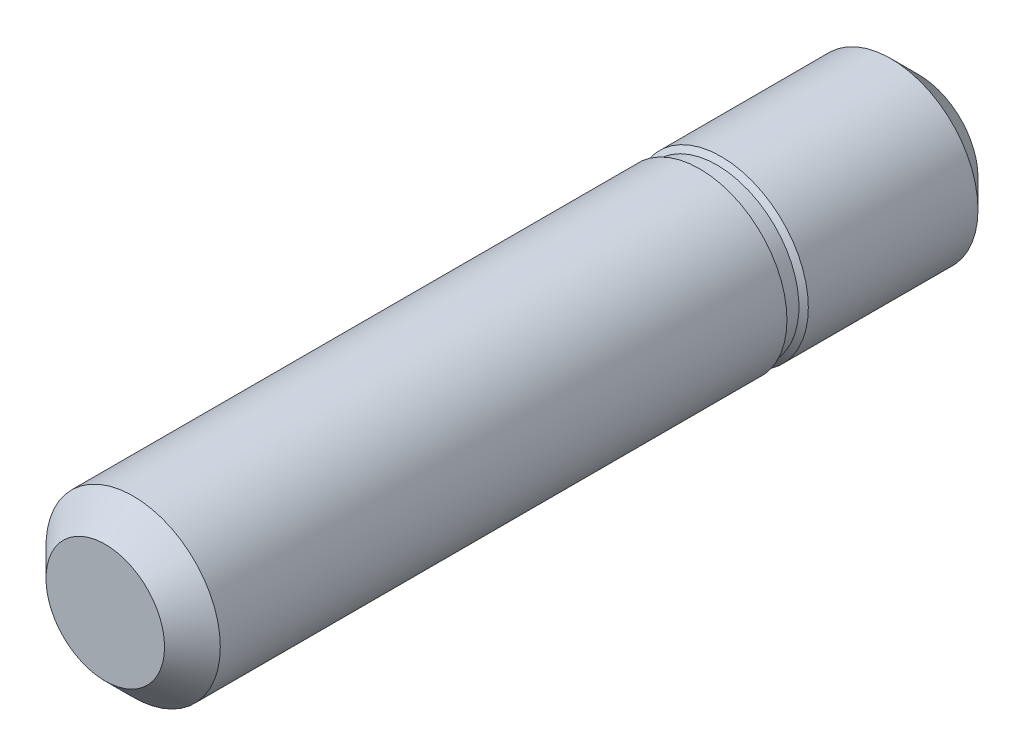
ISO-10303-21;
HEADER;
FILE_DESCRIPTION(('STEP AP214'),'2;1');
FILE_NAME('part.step','',(''),(''),'','','');
FILE_SCHEMA(('AUTOMOTIVE_DESIGN { 1 0 10303 214 1 1 1 1 }'));
ENDSEC;
DATA;
#1=APPLICATION_CONTEXT('core data for automotive mechanical design processes');
#2=APPLICATION_PROTOCOL_DEFINITION('international standard','automotive_design',2000,#1);
#3=PRODUCT_CONTEXT('',#1,'mechanical');
#4=PRODUCT('Part','Part','',(#3));
#5=PRODUCT_RELATED_PRODUCT_CATEGORY('part','',(#4));
#6=PRODUCT_DEFINITION_FORMATION('','',#4);
#7=PRODUCT_DEFINITION_CONTEXT('part definition',#1,'design');
#8=PRODUCT_DEFINITION('design','',#6,#7);
#9=PRODUCT_DEFINITION_SHAPE('','',#8);
#10=(LENGTH_UNIT() NAMED_UNIT(*) SI_UNIT(.MILLI.,.METRE.));
#11=(NAMED_UNIT(*) PLANE_ANGLE_UNIT() SI_UNIT($,.RADIAN.));
#12=(NAMED_UNIT(*) SI_UNIT($,.STERADIAN.) SOLID_ANGLE_UNIT());
#13=UNCERTAINTY_MEASURE_WITH_UNIT(LENGTH_MEASURE(1.E-05),#10,'distance_accuracy_value','');
#14=(GEOMETRIC_REPRESENTATION_CONTEXT(3) GLOBAL_UNCERTAINTY_ASSIGNED_CONTEXT((#13)) GLOBAL_UNIT_ASSIGNED_CONTEXT((#10,
#11,#12)) REPRESENTATION_CONTEXT('',''));
#15=CARTESIAN_POINT('',(0.,0.,0.));
#16=DIRECTION('',(0.,0.,1.));
#17=DIRECTION('',(1.,0.,0.));
#18=AXIS2_PLACEMENT_3D('',#15,#16,#17);
#19=CARTESIAN_POINT('',(0.,0.,-44.45));
#20=DIRECTION('',(0.,0.,1.));
#21=DIRECTION('',(1.,0.,0.));
#22=AXIS2_PLACEMENT_3D('',#19,#20,#21);
#23=CYLINDRICAL_SURFACE('',#22,4.7625);
#24=CARTESIAN_POINT('',(0.,0.,-42.926));
#25=DIRECTION('',(0.,0.,1.));
#26=DIRECTION('',(1.,0.,0.));
#27=AXIS2_PLACEMENT_3D('',#24,#25,#26);
#28=CIRCLE('',#27,4.7625);
#29=CARTESIAN_POINT('',(4.7625,0.,-42.926));
#30=VERTEX_POINT('',#29);
#31=EDGE_CURVE('E44',#30,#30,#28,.T.);
#32=ORIENTED_EDGE('',*,*,#31,.T.);
#33=EDGE_LOOP('',(#32));
#34=FACE_BOUND('',#33,.T.);
#35=CARTESIAN_POINT('',(0.,0.,-33.655));
#36=DIRECTION('',(0.,0.,-1.));
#37=DIRECTION('',(-1.,0.,0.));
#38=AXIS2_PLACEMENT_3D('',#35,#36,#37);
#39=CIRCLE('',#38,4.7625);
#40=CARTESIAN_POINT('',(-4.7625,0.,-33.655));
#41=VERTEX_POINT('',#40);
#42=EDGE_CURVE('E57',#41,#41,#39,.T.);
#43=ORIENTED_EDGE('',*,*,#42,.T.);
#44=EDGE_LOOP('',(#43));
#45=FACE_BOUND('',#44,.T.);
#46=ADVANCED_FACE('F37',(#34,#45),#23,.T.);
#47=CARTESIAN_POINT('',(0.,0.,-44.45));
#48=DIRECTION('',(0.,0.,1.));
#49=DIRECTION('',(1.,0.,0.));
#50=AXIS2_PLACEMENT_3D('',#47,#48,#49);
#51=PLANE('',#50);
#52=CARTESIAN_POINT('',(0.,0.,-44.45));
#53=DIRECTION('',(0.,0.,1.));
#54=DIRECTION('',(1.,0.,0.));
#55=AXIS2_PLACEMENT_3D('',#52,#53,#54);
#56=CIRCLE('',#55,3.2385);
#57=CARTESIAN_POINT('',(3.2385,0.,-44.45));
#58=VERTEX_POINT('',#57);
#59=EDGE_CURVE('E10',#58,#58,#56,.F.);
#60=ORIENTED_EDGE('',*,*,#59,.T.);
#61=EDGE_LOOP('',(#60));
#62=FACE_BOUND('',#61,.T.);
#63=ADVANCED_FACE('F98',(#62),#51,.F.);
#64=CARTESIAN_POINT('',(0.,0.,-33.4205555630491));
#65=DIRECTION('',(0.,0.,-1.));
#66=DIRECTION('',(-1.,0.,0.));
#67=AXIS2_PLACEMENT_3D('',#64,#65,#66);
#68=CONICAL_SURFACE('',#67,4.4831,0.872664625997178);
#69=ORIENTED_EDGE('',*,*,#42,.F.);
#70=EDGE_LOOP('',(#69));
#71=FACE_BOUND('',#70,.T.);
#72=CARTESIAN_POINT('',(0.,0.,-33.4205555630491));
#73=DIRECTION('',(0.,0.,-1.));
#74=DIRECTION('',(-1.,0.,0.));
#75=AXIS2_PLACEMENT_3D('',#72,#73,#74);
#76=CIRCLE('',#75,4.4831);
#77=CARTESIAN_POINT('',(-4.4831,0.,-33.4205555630491));
#78=VERTEX_POINT('',#77);
#79=EDGE_CURVE('E66',#78,#78,#76,.T.);
#80=ORIENTED_EDGE('',*,*,#79,.T.);
#81=EDGE_LOOP('',(#80));
#82=FACE_BOUND('',#81,.T.);
#83=ADVANCED_FACE('F70',(#71,#82),#68,.T.);
#84=CARTESIAN_POINT('',(-4.7625,0.,-32.4866));
#85=DIRECTION('',(0.,0.,1.));
#86=DIRECTION('',(1.,0.,0.));
#87=AXIS2_PLACEMENT_3D('',#84,#85,#86);
#88=PLANE('',#87);
#89=CARTESIAN_POINT('',(0.,0.,-32.4866));
#90=DIRECTION('',(0.,0.,-1.));
#91=DIRECTION('',(-1.,0.,0.));
#92=AXIS2_PLACEMENT_3D('',#89,#90,#91);
#93=CIRCLE('',#92,4.4831);
#94=CARTESIAN_POINT('',(-4.4831,0.,-32.4866));
#95=VERTEX_POINT('',#94);
#96=EDGE_CURVE('E63',#95,#95,#93,.T.);
#97=ORIENTED_EDGE('',*,*,#96,.F.);
#98=EDGE_LOOP('',(#97));
#99=FACE_BOUND('',#98,.T.);
#100=CARTESIAN_POINT('',(0.,0.,-32.4866));
#101=DIRECTION('',(0.,0.,-1.));
#102=DIRECTION('',(-1.,0.,0.));
#103=AXIS2_PLACEMENT_3D('',#100,#101,#102);
#104=CIRCLE('',#103,4.7625);
#105=CARTESIAN_POINT('',(-4.7625,0.,-32.4866));
#106=VERTEX_POINT('',#105);
#107=EDGE_CURVE('E60',#106,#106,#104,.T.);
#108=ORIENTED_EDGE('',*,*,#107,.T.);
#109=EDGE_LOOP('',(#108));
#110=FACE_BOUND('',#109,.T.);
#111=ADVANCED_FACE('F76',(#99,#110),#88,.F.);
#112=CARTESIAN_POINT('',(0.,0.,-44.45));
#113=DIRECTION('',(0.,0.,-1.));
#114=DIRECTION('',(-1.,0.,0.));
#115=AXIS2_PLACEMENT_3D('',#112,#113,#114);
#116=CYLINDRICAL_SURFACE('',#115,4.4831);
#117=ORIENTED_EDGE('',*,*,#79,.F.);
#118=EDGE_LOOP('',(#117));
#119=FACE_BOUND('',#118,.T.);
#120=ORIENTED_EDGE('',*,*,#96,.T.);
#121=EDGE_LOOP('',(#120));
#122=FACE_BOUND('',#121,.T.);
#123=ADVANCED_FACE('F72',(#119,#122),#116,.T.);
#124=CARTESIAN_POINT('',(0.,0.,0.));
#125=DIRECTION('',(0.,0.,1.));
#126=DIRECTION('',(1.,0.,0.));
#127=AXIS2_PLACEMENT_3D('',#124,#125,#126);
#128=PLANE('',#127);
#129=CARTESIAN_POINT('',(0.,0.,0.));
#130=DIRECTION('',(0.,0.,1.));
#131=DIRECTION('',(1.,0.,0.));
#132=AXIS2_PLACEMENT_3D('',#129,#130,#131);
#133=CIRCLE('',#132,3.23849999999998);
#134=CARTESIAN_POINT('',(3.23849999999998,0.,0.));
#135=VERTEX_POINT('',#134);
#136=EDGE_CURVE('E52',#135,#135,#133,.T.);
#137=ORIENTED_EDGE('',*,*,#136,.T.);
#138=EDGE_LOOP('',(#137));
#139=FACE_BOUND('',#138,.T.);
#140=ADVANCED_FACE('F75',(#139),#128,.T.);
#141=CARTESIAN_POINT('',(0.,0.,-1.52400000000001));
#142=DIRECTION('',(0.,0.,1.));
#143=DIRECTION('',(1.,0.,0.));
#144=AXIS2_PLACEMENT_3D('',#141,#142,#143);
#145=CIRCLE('',#144,4.7625);
#146=CARTESIAN_POINT('',(4.7625,0.,-1.52400000000001));
#147=VERTEX_POINT('',#146);
#148=EDGE_CURVE('E48',#147,#147,#145,.F.);
#149=ORIENTED_EDGE('',*,*,#148,.T.);
#150=EDGE_LOOP('',(#149));
#151=FACE_BOUND('',#150,.T.);
#152=ORIENTED_EDGE('',*,*,#107,.F.);
#153=EDGE_LOOP('',(#152));
#154=FACE_BOUND('',#153,.T.);
#155=ADVANCED_FACE('F85',(#151,#154),#23,.T.);
#156=CARTESIAN_POINT('',(0.,0.,0.));
#157=DIRECTION('',(0.,0.,-1.));
#158=DIRECTION('',(-1.,0.,0.));
#159=AXIS2_PLACEMENT_3D('',#156,#157,#158);
#160=CONICAL_SURFACE('',#159,3.23849999999998,0.78539816339745);
#161=ORIENTED_EDGE('',*,*,#148,.F.);
#162=EDGE_LOOP('',(#161));
#163=FACE_BOUND('',#162,.T.);
#164=ORIENTED_EDGE('',*,*,#136,.F.);
#165=EDGE_LOOP('',(#164));
#166=FACE_BOUND('',#165,.T.);
#167=ADVANCED_FACE('F87',(#163,#166),#160,.T.);
#168=CARTESIAN_POINT('',(0.,0.,-42.926));
#169=DIRECTION('',(0.,0.,1.));
#170=DIRECTION('',(1.,0.,0.));
#171=AXIS2_PLACEMENT_3D('',#168,#169,#170);
#172=CONICAL_SURFACE('',#171,4.7625,0.785398163397451);
#173=ORIENTED_EDGE('',*,*,#59,.F.);
#174=EDGE_LOOP('',(#173));
#175=FACE_BOUND('',#174,.T.);
#176=ORIENTED_EDGE('',*,*,#31,.F.);
#177=EDGE_LOOP('',(#176));
#178=FACE_BOUND('',#177,.T.);
#179=ADVANCED_FACE('F39',(#175,#178),#172,.T.);
#180=CLOSED_SHELL('',(#46,#63,#83,#111,#123,#140,#155,#167,#179));
#181=MANIFOLD_SOLID_BREP('B2',#180);
#182=ADVANCED_BREP_SHAPE_REPRESENTATION('',(#18,#181),#14);
#183=SHAPE_DEFINITION_REPRESENTATION(#9,#182);
ENDSEC;
END-ISO-10303-21;
